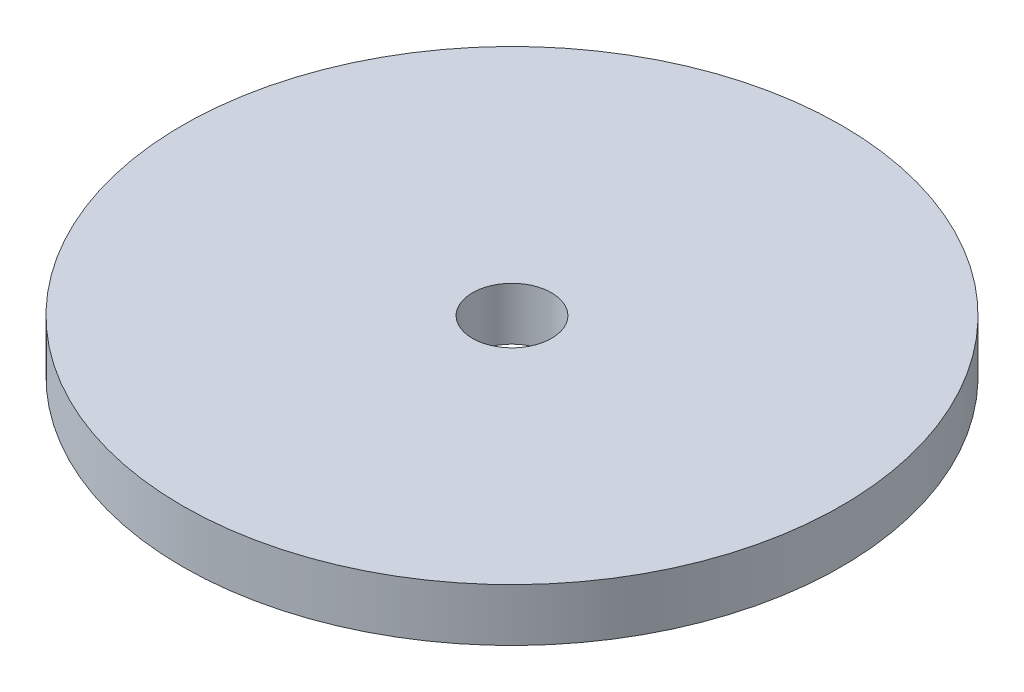
ISO-10303-21;
HEADER;
FILE_DESCRIPTION(('STEP AP214'),'2;1');
FILE_NAME('part.step','',(''),(''),'','','');
FILE_SCHEMA(('AUTOMOTIVE_DESIGN { 1 0 10303 214 1 1 1 1 }'));
ENDSEC;
DATA;
#1=APPLICATION_CONTEXT('core data for automotive mechanical design processes');
#2=APPLICATION_PROTOCOL_DEFINITION('international standard','automotive_design',2000,#1);
#3=PRODUCT_CONTEXT('',#1,'mechanical');
#4=PRODUCT('Part','Part','',(#3));
#5=PRODUCT_RELATED_PRODUCT_CATEGORY('part','',(#4));
#6=PRODUCT_DEFINITION_FORMATION('','',#4);
#7=PRODUCT_DEFINITION_CONTEXT('part definition',#1,'design');
#8=PRODUCT_DEFINITION('design','',#6,#7);
#9=PRODUCT_DEFINITION_SHAPE('','',#8);
#10=(LENGTH_UNIT() NAMED_UNIT(*) SI_UNIT(.MILLI.,.METRE.));
#11=(NAMED_UNIT(*) PLANE_ANGLE_UNIT() SI_UNIT($,.RADIAN.));
#12=(NAMED_UNIT(*) SI_UNIT($,.STERADIAN.) SOLID_ANGLE_UNIT());
#13=UNCERTAINTY_MEASURE_WITH_UNIT(LENGTH_MEASURE(1.E-05),#10,'distance_accuracy_value','');
#14=(GEOMETRIC_REPRESENTATION_CONTEXT(3) GLOBAL_UNCERTAINTY_ASSIGNED_CONTEXT((#13)) GLOBAL_UNIT_ASSIGNED_CONTEXT((#10,
#11,#12)) REPRESENTATION_CONTEXT('',''));
#15=CARTESIAN_POINT('',(0.,0.,0.));
#16=DIRECTION('',(0.,0.,1.));
#17=DIRECTION('',(1.,0.,0.));
#18=AXIS2_PLACEMENT_3D('',#15,#16,#17);
#19=CARTESIAN_POINT('',(0.,2.,0.));
#20=DIRECTION('',(0.,1.,0.));
#21=DIRECTION('',(0.,0.,1.));
#22=AXIS2_PLACEMENT_3D('',#19,#20,#21);
#23=PLANE('',#22);
#24=CARTESIAN_POINT('',(0.,2.,0.));
#25=DIRECTION('',(0.,1.,0.));
#26=DIRECTION('',(0.,0.,1.));
#27=AXIS2_PLACEMENT_3D('',#24,#25,#26);
#28=CIRCLE('',#27,12.5);
#29=CARTESIAN_POINT('',(0.,2.,12.5));
#30=VERTEX_POINT('',#29);
#31=EDGE_CURVE('E10',#30,#30,#28,.T.);
#32=ORIENTED_EDGE('',*,*,#31,.T.);
#33=EDGE_LOOP('',(#32));
#34=FACE_BOUND('',#33,.T.);
#35=CARTESIAN_POINT('',(0.,2.,0.));
#36=DIRECTION('',(0.,1.,0.));
#37=DIRECTION('',(0.,0.,1.));
#38=AXIS2_PLACEMENT_3D('',#35,#36,#37);
#39=CIRCLE('',#38,1.5);
#40=CARTESIAN_POINT('',(0.,2.,1.5));
#41=VERTEX_POINT('',#40);
#42=EDGE_CURVE('E47',#41,#41,#39,.T.);
#43=ORIENTED_EDGE('',*,*,#42,.F.);
#44=EDGE_LOOP('',(#43));
#45=FACE_BOUND('',#44,.T.);
#46=ADVANCED_FACE('F36',(#34,#45),#23,.T.);
#47=CARTESIAN_POINT('',(0.,0.,0.));
#48=DIRECTION('',(0.,1.,0.));
#49=DIRECTION('',(0.,0.,1.));
#50=AXIS2_PLACEMENT_3D('',#47,#48,#49);
#51=PLANE('',#50);
#52=CARTESIAN_POINT('',(0.,0.,0.));
#53=DIRECTION('',(0.,1.,0.));
#54=DIRECTION('',(0.,0.,1.));
#55=AXIS2_PLACEMENT_3D('',#52,#53,#54);
#56=CIRCLE('',#55,12.5);
#57=CARTESIAN_POINT('',(0.,0.,12.5));
#58=VERTEX_POINT('',#57);
#59=EDGE_CURVE('E40',#58,#58,#56,.T.);
#60=ORIENTED_EDGE('',*,*,#59,.F.);
#61=EDGE_LOOP('',(#60));
#62=FACE_BOUND('',#61,.T.);
#63=CARTESIAN_POINT('',(0.,0.,0.));
#64=DIRECTION('',(0.,1.,0.));
#65=DIRECTION('',(0.,0.,1.));
#66=AXIS2_PLACEMENT_3D('',#63,#64,#65);
#67=CIRCLE('',#66,1.5);
#68=CARTESIAN_POINT('',(0.,0.,1.5));
#69=VERTEX_POINT('',#68);
#70=EDGE_CURVE('E49',#69,#69,#67,.T.);
#71=ORIENTED_EDGE('',*,*,#70,.T.);
#72=EDGE_LOOP('',(#71));
#73=FACE_BOUND('',#72,.T.);
#74=ADVANCED_FACE('F59',(#62,#73),#51,.F.);
#75=CARTESIAN_POINT('',(0.,2.,0.));
#76=DIRECTION('',(0.,-1.,0.));
#77=DIRECTION('',(0.,0.,-1.));
#78=AXIS2_PLACEMENT_3D('',#75,#76,#77);
#79=CYLINDRICAL_SURFACE('',#78,12.5);
#80=ORIENTED_EDGE('',*,*,#31,.F.);
#81=EDGE_LOOP('',(#80));
#82=FACE_BOUND('',#81,.T.);
#83=ORIENTED_EDGE('',*,*,#59,.T.);
#84=EDGE_LOOP('',(#83));
#85=FACE_BOUND('',#84,.T.);
#86=ADVANCED_FACE('F38',(#82,#85),#79,.T.);
#87=CARTESIAN_POINT('',(0.,2.,0.));
#88=DIRECTION('',(0.,-1.,0.));
#89=DIRECTION('',(0.,0.,-1.));
#90=AXIS2_PLACEMENT_3D('',#87,#88,#89);
#91=CYLINDRICAL_SURFACE('',#90,1.5);
#92=ORIENTED_EDGE('',*,*,#42,.T.);
#93=EDGE_LOOP('',(#92));
#94=FACE_BOUND('',#93,.T.);
#95=ORIENTED_EDGE('',*,*,#70,.F.);
#96=EDGE_LOOP('',(#95));
#97=FACE_BOUND('',#96,.T.);
#98=ADVANCED_FACE('F55',(#94,#97),#91,.F.);
#99=CLOSED_SHELL('',(#46,#74,#86,#98));
#100=MANIFOLD_SOLID_BREP('B2',#99);
#101=ADVANCED_BREP_SHAPE_REPRESENTATION('',(#18,#100),#14);
#102=SHAPE_DEFINITION_REPRESENTATION(#9,#101);
ENDSEC;
END-ISO-10303-21;
